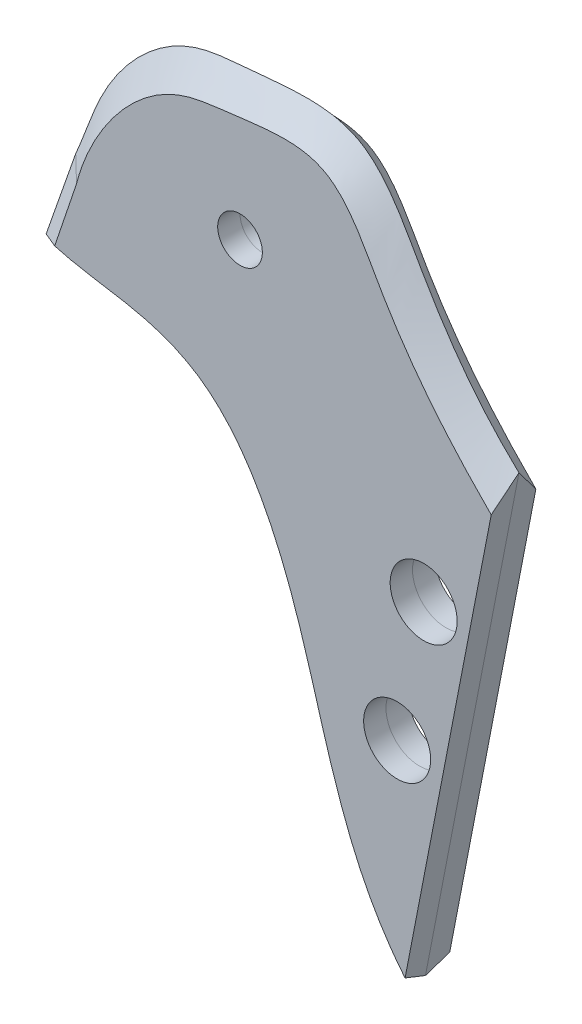
ISO-10303-21;
HEADER;
FILE_DESCRIPTION(('STEP AP214'),'2;1');
FILE_NAME('part.step','',(''),(''),'','','');
FILE_SCHEMA(('AUTOMOTIVE_DESIGN { 1 0 10303 214 1 1 1 1 }'));
ENDSEC;
DATA;
#1=APPLICATION_CONTEXT('core data for automotive mechanical design processes');
#2=APPLICATION_PROTOCOL_DEFINITION('international standard','automotive_design',2000,#1);
#3=PRODUCT_CONTEXT('',#1,'mechanical');
#4=PRODUCT('Part','Part','',(#3));
#5=PRODUCT_RELATED_PRODUCT_CATEGORY('part','',(#4));
#6=PRODUCT_DEFINITION_FORMATION('','',#4);
#7=PRODUCT_DEFINITION_CONTEXT('part definition',#1,'design');
#8=PRODUCT_DEFINITION('design','',#6,#7);
#9=PRODUCT_DEFINITION_SHAPE('','',#8);
#10=(LENGTH_UNIT() NAMED_UNIT(*) SI_UNIT(.MILLI.,.METRE.));
#11=(NAMED_UNIT(*) PLANE_ANGLE_UNIT() SI_UNIT($,.RADIAN.));
#12=(NAMED_UNIT(*) SI_UNIT($,.STERADIAN.) SOLID_ANGLE_UNIT());
#13=UNCERTAINTY_MEASURE_WITH_UNIT(LENGTH_MEASURE(1.E-05),#10,'distance_accuracy_value','');
#14=(GEOMETRIC_REPRESENTATION_CONTEXT(3) GLOBAL_UNCERTAINTY_ASSIGNED_CONTEXT((#13)) GLOBAL_UNIT_ASSIGNED_CONTEXT((#10,
#11,#12)) REPRESENTATION_CONTEXT('',''));
#15=CARTESIAN_POINT('',(0.,0.,0.));
#16=DIRECTION('',(0.,0.,1.));
#17=DIRECTION('',(1.,0.,0.));
#18=AXIS2_PLACEMENT_3D('',#15,#16,#17);
#19=CARTESIAN_POINT('',(0.,0.,16.01702912884));
#20=DIRECTION('',(0.,0.,-1.));
#21=DIRECTION('',(-1.,0.,0.));
#22=AXIS2_PLACEMENT_3D('',#19,#20,#21);
#23=PLANE('',#22);
#24=CARTESIAN_POINT('',(37.1997621715917,16.6182196540824,16.01702912884));
#25=DIRECTION('',(0.,0.,-1.));
#26=DIRECTION('',(-1.,0.,0.));
#27=AXIS2_PLACEMENT_3D('',#24,#25,#26);
#28=CIRCLE('',#27,1.7);
#29=CARTESIAN_POINT('',(35.4997621715917,16.6182196540824,16.01702912884));
#30=VERTEX_POINT('',#29);
#31=EDGE_CURVE('E188',#30,#30,#28,.F.);
#32=ORIENTED_EDGE('',*,*,#31,.T.);
#33=EDGE_LOOP('',(#32));
#34=FACE_BOUND('',#33,.T.);
#35=CARTESIAN_POINT('',(49.1635521652925,-10.4166543376605,16.01702912884));
#36=DIRECTION('',(0.,0.,-1.));
#37=DIRECTION('',(-1.,0.,0.));
#38=AXIS2_PLACEMENT_3D('',#35,#36,#37);
#39=CIRCLE('',#38,2.54999999999999);
#40=CARTESIAN_POINT('',(46.6135521652925,-10.4166543376605,16.01702912884));
#41=VERTEX_POINT('',#40);
#42=EDGE_CURVE('E240',#41,#41,#39,.F.);
#43=ORIENTED_EDGE('',*,*,#42,.T.);
#44=EDGE_LOOP('',(#43));
#45=FACE_BOUND('',#44,.T.);
#46=CARTESIAN_POINT('',(56.7374791845424,10.1611521460587,16.01702912884));
#47=CARTESIAN_POINT('',(53.6201790954461,13.0770034793296,16.01702912884));
#48=CARTESIAN_POINT('',(50.0180932993099,18.1127380968674,16.01702912884));
#49=CARTESIAN_POINT('',(45.1972513004322,27.6593441288069,16.01702912884));
#50=CARTESIAN_POINT('',(37.5823057666446,26.5396477813974,16.01702912884));
#51=CARTESIAN_POINT('',(30.2888783292712,26.1262149818505,16.01702912884));
#52=CARTESIAN_POINT('',(25.1507624600812,20.7991546822461,16.01702912884));
#53=CARTESIAN_POINT('',(23.7062806262853,15.9520347530322,16.01702912884));
#54=CARTESIAN_POINT('',(22.9879280203535,14.3317152162057,16.01702912884));
#55=B_SPLINE_CURVE_WITH_KNOTS('',3,(#46,#47,#48,#49,#50,#51,#52,#53,#54),.UNSPECIFIED.,.F.,.F.,
(4,1,1,1,1,1,4),(0.0984022232735256,0.332263847237948,0.478784406260262,0.635689441844704,
0.712428507943073,0.897170220945366,1.),.UNSPECIFIED.);
#56=CARTESIAN_POINT('',(56.7374791845424,10.1611521460587,16.01702912884));
#57=VERTEX_POINT('',#56);
#58=CARTESIAN_POINT('',(22.9879280203535,14.3317152162057,16.01702912884));
#59=VERTEX_POINT('',#58);
#60=EDGE_CURVE('E13',#57,#59,#55,.T.);
#61=ORIENTED_EDGE('',*,*,#60,.F.);
#62=DIRECTION('',(-0.190360349727867,-0.981714284938079,0.));
#63=VECTOR('',#62,1.);
#64=CARTESIAN_POINT('',(54.4053665233455,-1.86587090183388,16.01702912884));
#65=LINE('',#64,#63);
#66=CARTESIAN_POINT('',(49.6196669779243,-26.5463761324561,16.01702912884));
#67=VERTEX_POINT('',#66);
#68=EDGE_CURVE('E118',#57,#67,#65,.T.);
#69=ORIENTED_EDGE('',*,*,#68,.T.);
#70=CARTESIAN_POINT('',(20.7358239624741,7.90904808817925,16.01702912884));
#71=CARTESIAN_POINT('',(22.1719138725132,7.78885329292571,16.01702912884));
#72=CARTESIAN_POINT('',(25.4971097036187,7.8573029401953,16.01702912884));
#73=CARTESIAN_POINT('',(29.7297821332798,6.63741892427981,16.01702912884));
#74=CARTESIAN_POINT('',(35.1017046824072,5.01907956722342,16.01702912884));
#75=CARTESIAN_POINT('',(42.865459225879,-6.75778599450246,16.01702912884));
#76=CARTESIAN_POINT('',(43.2492805940054,-18.7500409121456,16.01702912884));
#77=CARTESIAN_POINT('',(49.6196669779243,-26.5463761324561,16.01702912884));
#78=B_SPLINE_CURVE_WITH_KNOTS('',3,(#70,#71,#72,#73,#74,#75,#76,#77),.UNSPECIFIED.,.F.,.F.,(4,1,
1,1,1,4),(0.,0.0884615216593502,0.20051623120789,0.26879982875652,0.4246044812526,1.),.UNSPECIFIED.);
#79=CARTESIAN_POINT('',(20.7358239624741,7.90904808817925,16.01702912884));
#80=VERTEX_POINT('',#79);
#81=EDGE_CURVE('E59',#80,#67,#78,.T.);
#82=ORIENTED_EDGE('',*,*,#81,.F.);
#83=DIRECTION('',(-0.330896267797108,-0.943667134088045,0.));
#84=VECTOR('',#83,1.);
#85=CARTESIAN_POINT('',(22.9879280203535,14.3317152162057,16.01702912884));
#86=LINE('',#85,#84);
#87=EDGE_CURVE('E224',#59,#80,#86,.T.);
#88=ORIENTED_EDGE('',*,*,#87,.F.);
#89=EDGE_LOOP('',(#61,#69,#82,#88));
#90=FACE_BOUND('',#89,.T.);
#91=CARTESIAN_POINT('',(51.1823021652925,-0.288224536730692,16.01702912884));
#92=DIRECTION('',(0.,0.,-1.));
#93=DIRECTION('',(-1.,0.,0.));
#94=AXIS2_PLACEMENT_3D('',#91,#92,#93);
#95=CIRCLE('',#94,2.55);
#96=CARTESIAN_POINT('',(48.6323021652925,-0.288224536730692,16.01702912884));
#97=VERTEX_POINT('',#96);
#98=EDGE_CURVE('E295',#97,#97,#95,.F.);
#99=ORIENTED_EDGE('',*,*,#98,.T.);
#100=EDGE_LOOP('',(#99));
#101=FACE_BOUND('',#100,.T.);
#102=ADVANCED_FACE('F50',(#34,#45,#90,#101),#23,.T.);
#103=CARTESIAN_POINT('',(56.7374791845424,10.1611521460587,16.01702912884));
#104=CARTESIAN_POINT('',(56.3247621715917,8.03271422382369,17.71702912884));
#105=CARTESIAN_POINT('',(53.6201790954461,13.0770034793296,16.01702912884));
#106=CARTESIAN_POINT('',(53.4815340141107,10.8813682024356,17.71702912884));
#107=CARTESIAN_POINT('',(50.9276386605399,16.8411889664497,16.01702912884));
#108=CARTESIAN_POINT('',(50.6303744477103,14.1981402639373,17.71702912884));
#109=CARTESIAN_POINT('',(47.4668919484403,23.1648253070632,16.01702912884));
#110=CARTESIAN_POINT('',(47.2667425586454,19.7150457705081,17.71702912884));
#111=CARTESIAN_POINT('',(45.4662591057677,25.8150722220901,16.01702912884));
#112=CARTESIAN_POINT('',(45.7145385390748,22.7407509049763,17.71702912884));
#113=CARTESIAN_POINT('',(41.4908067982299,27.1143510815713,16.01702912884));
#114=CARTESIAN_POINT('',(42.6933411886686,25.2368619241954,17.71702912884));
#115=CARTESIAN_POINT('',(37.9577758668488,26.6416571868208,16.01702912884));
#116=CARTESIAN_POINT('',(39.4587516791819,24.9632796151015,17.71702912884));
#117=CARTESIAN_POINT('',(34.4403844972373,26.3615458783455,16.01702912884));
#118=CARTESIAN_POINT('',(36.052554326043,24.5184502229449,17.71702912884));
#119=CARTESIAN_POINT('',(32.7201382629059,26.1402152904171,16.01702912884));
#120=CARTESIAN_POINT('',(34.3900462403712,24.3501831932131,17.71702912884));
#121=CARTESIAN_POINT('',(28.8729837341728,24.6582535582475,16.01702912884));
#122=CARTESIAN_POINT('',(30.6843016318662,23.4039560479854,17.71702912884));
#123=CARTESIAN_POINT('',(25.0319533013774,20.400477296728,16.01702912884));
#124=CARTESIAN_POINT('',(26.9291205566539,19.7912997497251,17.71702912884));
#125=CARTESIAN_POINT('',(23.7062806262853,15.9520347530322,16.01702912884));
#126=CARTESIAN_POINT('',(25.1314869237919,15.6032090618174,17.71702912884));
#127=CARTESIAN_POINT('',(22.9879280203535,14.3317152162057,16.01702912884));
#128=CARTESIAN_POINT('',(24.7497084623282,14.0682196540823,17.71702912884));
#129=B_SPLINE_SURFACE_WITH_KNOTS('',3,1,((#103,#104),(#105,#106),(#107,#108),(#109,#110),(#111,
#112),(#113,#114),(#115,#116),(#117,#118),(#119,#120),(#121,#122),(#123,#124),(#125,#126),(#127,
#128)),.UNSPECIFIED.,.F.,.F.,.F.,(4,1,1,1,1,1,1,1,1,1,4),(2,2),(0.,0.259385759372132,
0.315366468989364,0.421897871540711,0.46461990204709,0.595927843258402,0.621804756140367,
0.681042367805029,0.707276749613521,0.88594716878297,1.),(0.,1.),.UNSPECIFIED.);
#130=DIRECTION('',(0.715479586900087,-0.107008621191608,0.69038982880685));
#131=VECTOR('',#130,1.);
#132=CARTESIAN_POINT('',(23.8688182413409,14.199967435144,16.86702912884));
#133=LINE('',#132,#131);
#134=CARTESIAN_POINT('',(24.7497084623282,14.0682196540823,17.71702912884));
#135=VERTEX_POINT('',#134);
#136=EDGE_CURVE('E111',#59,#135,#133,.T.);
#137=CARTESIAN_POINT('',(56.3247621715917,8.03271422382369,17.71702912884));
#138=CARTESIAN_POINT('',(52.8679076907351,11.496165528097,17.71702912884));
#139=CARTESIAN_POINT('',(48.8599680154124,16.3360273622185,17.71702912884));
#140=CARTESIAN_POINT('',(44.2241470254929,25.775486125325,17.71702912884));
#141=CARTESIAN_POINT('',(37.567466531524,24.6409319402532,17.71702912884));
#142=CARTESIAN_POINT('',(29.7072493366158,23.9216854788249,17.71702912884));
#143=CARTESIAN_POINT('',(25.7295651741228,18.0078595906483,17.71702912884));
#144=CARTESIAN_POINT('',(24.7497084623282,14.0682196540823,17.71702912884));
#145=B_SPLINE_CURVE_WITH_KNOTS('',3,(#137,#138,#139,#140,#141,#142,#143,#144),.UNSPECIFIED.,.F.,
.F.,(4,1,1,1,1,4),(0.,0.315366468989364,0.46461990204709,0.621804756140367,0.707276749613521,
1.),.UNSPECIFIED.);
#146=CARTESIAN_POINT('',(56.3247621715917,8.03271422382369,17.71702912884));
#147=VERTEX_POINT('',#146);
#148=EDGE_CURVE('E94',#147,#135,#145,.T.);
#149=DIRECTION('',(0.149801028702046,0.772544334917706,-0.617037196922818));
#150=VECTOR('',#149,1.);
#151=CARTESIAN_POINT('',(56.5311206780671,9.09693318494118,16.86702912884));
#152=LINE('',#151,#150);
#153=EDGE_CURVE('E109',#147,#57,#152,.T.);
#154=ORIENTED_EDGE('',*,*,#60,.T.);
#155=ORIENTED_EDGE('',*,*,#136,.T.);
#156=ORIENTED_EDGE('',*,*,#148,.F.);
#157=ORIENTED_EDGE('',*,*,#153,.T.);
#158=EDGE_LOOP('',(#154,#155,#156,#157));
#159=FACE_BOUND('',#158,.T.);
#160=ADVANCED_FACE('F108',(#159),#129,.T.);
#161=CARTESIAN_POINT('',(22.9879280203535,14.3317152162057,16.01702912884));
#162=CARTESIAN_POINT('',(24.7497084623282,14.0682196540823,17.71702912884));
#163=CARTESIAN_POINT('',(22.6125773440403,13.261270694868,16.01702912884));
#164=CARTESIAN_POINT('',(24.4726287269215,13.2476373607624,17.71702912884));
#165=CARTESIAN_POINT('',(22.2372266677271,12.1908261735302,16.01702912884));
#166=CARTESIAN_POINT('',(24.1955489915148,12.4270550674425,17.71702912884));
#167=CARTESIAN_POINT('',(21.4865253151006,10.0499371308547,16.01702912884));
#168=CARTESIAN_POINT('',(23.6413895207013,10.7858904808026,17.71702912884));
#169=CARTESIAN_POINT('',(21.1111746387874,8.97949260951699,16.01702912884));
#170=CARTESIAN_POINT('',(23.3643097852946,9.96530818748272,17.71702912884));
#171=CARTESIAN_POINT('',(20.7358239624741,7.90904808817925,16.01702912884));
#172=CARTESIAN_POINT('',(23.0872300498878,9.14472589416278,17.71702912884));
#173=B_SPLINE_SURFACE_WITH_KNOTS('',3,1,((#161,#162),(#163,#164),(#165,#166),(#167,#168),(#169,
#170),(#171,#172)),.UNSPECIFIED.,.F.,.F.,.F.,(4,2,4),(2,2),(0.,0.5,1.),(0.,1.),.UNSPECIFIED.);
#174=DIRECTION('',(0.745595344172381,0.391814763077272,0.539044315602316));
#175=VECTOR('',#174,1.);
#176=CARTESIAN_POINT('',(21.911527006181,8.52688699117102,16.86702912884));
#177=LINE('',#176,#175);
#178=CARTESIAN_POINT('',(23.0872300498878,9.14472589416278,17.71702912884));
#179=VERTEX_POINT('',#178);
#180=EDGE_CURVE('E124',#80,#179,#177,.T.);
#181=DIRECTION('',(-0.319916718913096,-0.947445667550324,0.));
#182=VECTOR('',#181,1.);
#183=CARTESIAN_POINT('',(24.7497084623282,14.0682196540823,17.71702912884));
#184=LINE('',#183,#182);
#185=EDGE_CURVE('E183',#135,#179,#184,.T.);
#186=ORIENTED_EDGE('',*,*,#87,.T.);
#187=ORIENTED_EDGE('',*,*,#180,.T.);
#188=ORIENTED_EDGE('',*,*,#185,.F.);
#189=ORIENTED_EDGE('',*,*,#136,.F.);
#190=EDGE_LOOP('',(#186,#187,#188,#189));
#191=FACE_BOUND('',#190,.T.);
#192=ADVANCED_FACE('F152',(#191),#173,.T.);
#193=CARTESIAN_POINT('',(42.2011849808601,24.8148172093596,17.71702912884));
#194=DIRECTION('',(0.,0.,1.));
#195=DIRECTION('',(1.,0.,0.));
#196=AXIS2_PLACEMENT_3D('',#193,#194,#195);
#197=PLANE('',#196);
#198=CARTESIAN_POINT('',(49.1635521652925,-10.4166543376605,17.71702912884));
#199=DIRECTION('',(0.,0.,1.));
#200=DIRECTION('',(1.,0.,0.));
#201=AXIS2_PLACEMENT_3D('',#198,#199,#200);
#202=CIRCLE('',#201,2.54999999999999);
#203=CARTESIAN_POINT('',(51.7135521652925,-10.4166543376605,17.71702912884));
#204=VERTEX_POINT('',#203);
#205=EDGE_CURVE('E225',#204,#204,#202,.T.);
#206=ORIENTED_EDGE('',*,*,#205,.F.);
#207=EDGE_LOOP('',(#206));
#208=FACE_BOUND('',#207,.T.);
#209=CARTESIAN_POINT('',(51.1823021652925,-0.288224536730692,17.71702912884));
#210=DIRECTION('',(0.,0.,1.));
#211=DIRECTION('',(1.,0.,0.));
#212=AXIS2_PLACEMENT_3D('',#209,#210,#211);
#213=CIRCLE('',#212,2.55);
#214=CARTESIAN_POINT('',(53.7323021652925,-0.288224536730692,17.71702912884));
#215=VERTEX_POINT('',#214);
#216=EDGE_CURVE('E122',#215,#215,#213,.T.);
#217=ORIENTED_EDGE('',*,*,#216,.F.);
#218=EDGE_LOOP('',(#217));
#219=FACE_BOUND('',#218,.T.);
#220=CARTESIAN_POINT('',(37.1997621715917,16.6182196540824,17.71702912884));
#221=DIRECTION('',(0.,0.,1.));
#222=DIRECTION('',(1.,0.,0.));
#223=AXIS2_PLACEMENT_3D('',#220,#221,#222);
#224=CIRCLE('',#223,1.7);
#225=CARTESIAN_POINT('',(38.8997621715917,16.6182196540824,17.71702912884));
#226=VERTEX_POINT('',#225);
#227=EDGE_CURVE('E119',#226,#226,#224,.T.);
#228=ORIENTED_EDGE('',*,*,#227,.F.);
#229=EDGE_LOOP('',(#228));
#230=FACE_BOUND('',#229,.T.);
#231=ORIENTED_EDGE('',*,*,#148,.T.);
#232=ORIENTED_EDGE('',*,*,#185,.T.);
#233=CARTESIAN_POINT('',(23.0872300498878,9.14472589416278,17.71702912884));
#234=CARTESIAN_POINT('',(23.9071552614502,8.90389135487674,17.71702912884));
#235=CARTESIAN_POINT('',(26.4147155565695,8.40600553783021,17.71702912884));
#236=CARTESIAN_POINT('',(30.1574904202226,7.93532093414824,17.71702912884));
#237=CARTESIAN_POINT('',(35.409397744306,5.68865065157843,17.71702912884));
#238=CARTESIAN_POINT('',(43.4811194703326,-5.64116995348703,17.71702912884));
#239=CARTESIAN_POINT('',(43.5281504977051,-18.220731086188,17.71702912884));
#240=CARTESIAN_POINT('',(49.7666771672669,-25.7882245367307,17.71702912884));
#241=B_SPLINE_CURVE_WITH_KNOTS('',3,(#233,#234,#235,#236,#237,#238,#239,#240),.UNSPECIFIED.,.F.,
.F.,(4,1,1,1,1,4),(0.,0.0541824296374315,0.16221333097239,0.238719582243554,0.409718141961211,
1.),.UNSPECIFIED.);
#242=CARTESIAN_POINT('',(49.7666771672669,-25.7882245367307,17.71702912884));
#243=VERTEX_POINT('',#242);
#244=EDGE_CURVE('E97',#179,#243,#241,.T.);
#245=ORIENTED_EDGE('',*,*,#244,.T.);
#246=DIRECTION('',(0.190360349727867,0.981714284938079,0.));
#247=VECTOR('',#246,1.);
#248=CARTESIAN_POINT('',(49.7666771672668,-25.7882245367307,17.71702912884));
#249=LINE('',#248,#247);
#250=EDGE_CURVE('E90',#243,#147,#249,.T.);
#251=ORIENTED_EDGE('',*,*,#250,.T.);
#252=EDGE_LOOP('',(#231,#232,#245,#251));
#253=FACE_BOUND('',#252,.T.);
#254=ADVANCED_FACE('F93',(#208,#219,#230,#253),#197,.T.);
#255=CARTESIAN_POINT('',(54.4053665233455,-1.86587090183388,9.68452912884005));
#256=DIRECTION('',(-0.981714284938079,0.190360349727867,0.));
#257=DIRECTION('',(-0.190360349727867,-0.981714284938079,0.));
#258=AXIS2_PLACEMENT_3D('',#255,#256,#257);
#259=PLANE('',#258);
#260=ORIENTED_EDGE('',*,*,#68,.F.);
#261=ORIENTED_EDGE('',*,*,#153,.F.);
#262=ORIENTED_EDGE('',*,*,#250,.F.);
#263=DIRECTION('',(0.0787333022099367,0.40603837716383,0.910458073385745));
#264=VECTOR('',#263,1.);
#265=CARTESIAN_POINT('',(49.6931720725956,-26.1673003345934,16.86702912884));
#266=LINE('',#265,#264);
#267=EDGE_CURVE('E113',#67,#243,#266,.T.);
#268=ORIENTED_EDGE('',*,*,#267,.F.);
#269=EDGE_LOOP('',(#260,#261,#262,#268));
#270=FACE_BOUND('',#269,.T.);
#271=ADVANCED_FACE('F117',(#270),#259,.F.);
#272=CARTESIAN_POINT('',(20.7358239624741,7.90904808817925,16.01702912884));
#273=CARTESIAN_POINT('',(23.0872300498878,9.14472589416278,17.71702912884));
#274=CARTESIAN_POINT('',(21.6154249352378,7.83542911899976,16.01702912884));
#275=CARTESIAN_POINT('',(23.9071552614502,8.90389135487674,17.71702912884));
#276=CARTESIAN_POINT('',(23.0704306063669,7.80734939259081,16.01702912884));
#277=CARTESIAN_POINT('',(25.2746297965522,8.63237398497549,17.71702912884));
#278=CARTESIAN_POINT('',(25.7237718116332,7.64883772411055,16.01702912884));
#279=CARTESIAN_POINT('',(27.8016631900876,8.23158550964478,17.71702912884));
#280=CARTESIAN_POINT('',(28.0514115307685,7.1211363639849,16.01702912884));
#281=CARTESIAN_POINT('',(30.0713165943711,7.82488479816171,17.71702912884));
#282=CARTESIAN_POINT('',(30.4318693935687,6.42225490504846,16.01702912884));
#283=CARTESIAN_POINT('',(32.3191060824179,7.01062113064603,17.71702912884));
#284=CARTESIAN_POINT('',(32.1310659942215,5.91401084382313,16.01702912884));
#285=CARTESIAN_POINT('',(33.808843698735,6.21825298874981,17.71702912884));
#286=CARTESIAN_POINT('',(35.2507090670857,4.55315707015074,16.01702912884));
#287=CARTESIAN_POINT('',(36.4363137620361,4.24722654749472,17.71702912884));
#288=CARTESIAN_POINT('',(37.1332559765229,1.93741252860381,16.01702912884));
#289=CARTESIAN_POINT('',(38.1569260374253,1.71136973947847,17.71702912884));
#290=CARTESIAN_POINT('',(42.939430023337,-9.06895658906215,16.01702912884));
#291=CARTESIAN_POINT('',(43.4926032252927,-8.71277194953148,17.71702912884));
#292=CARTESIAN_POINT('',(43.2492805940054,-18.7500409121456,16.01702912884));
#293=CARTESIAN_POINT('',(43.6854801249277,-18.4115759741953,17.71702912884));
#294=CARTESIAN_POINT('',(49.6196669779243,-26.5463761324561,16.01702912884));
#295=CARTESIAN_POINT('',(49.7666771672669,-25.7882245367307,17.71702912884));
#296=B_SPLINE_SURFACE_WITH_KNOTS('',3,1,((#272,#273),(#274,#275),(#276,#277),(#278,#279),(#280,
#281),(#282,#283),(#284,#285),(#286,#287),(#288,#289),(#290,#291),(#292,#293),(#294,#295)),
.UNSPECIFIED.,.F.,.F.,.F.,(4,1,1,1,1,1,1,1,1,4),(2,2),(0.,0.0541824296374315,0.0884615216593502,
0.16221333097239,0.20051623120789,0.238719582243554,0.26879982875652,0.409718141961211,
0.4246044812526,1.),(0.,1.),.UNSPECIFIED.);
#297=ORIENTED_EDGE('',*,*,#81,.T.);
#298=ORIENTED_EDGE('',*,*,#267,.T.);
#299=ORIENTED_EDGE('',*,*,#244,.F.);
#300=ORIENTED_EDGE('',*,*,#180,.F.);
#301=EDGE_LOOP('',(#297,#298,#299,#300));
#302=FACE_BOUND('',#301,.T.);
#303=ADVANCED_FACE('F138',(#302),#296,.T.);
#304=CARTESIAN_POINT('',(49.1635521652925,-10.4166543376605,4.55453996073728));
#305=DIRECTION('',(0.,0.,1.));
#306=DIRECTION('',(1.,0.,0.));
#307=AXIS2_PLACEMENT_3D('',#304,#305,#306);
#308=CYLINDRICAL_SURFACE('',#307,2.54999999999999);
#309=ORIENTED_EDGE('',*,*,#205,.T.);
#310=EDGE_LOOP('',(#309));
#311=FACE_BOUND('',#310,.T.);
#312=ORIENTED_EDGE('',*,*,#42,.F.);
#313=EDGE_LOOP('',(#312));
#314=FACE_BOUND('',#313,.T.);
#315=ADVANCED_FACE('F52',(#311,#314),#308,.F.);
#316=CARTESIAN_POINT('',(51.1823021652925,-0.288224536730692,4.55453996073724));
#317=DIRECTION('',(0.,0.,1.));
#318=DIRECTION('',(1.,0.,0.));
#319=AXIS2_PLACEMENT_3D('',#316,#317,#318);
#320=CYLINDRICAL_SURFACE('',#319,2.55);
#321=ORIENTED_EDGE('',*,*,#216,.T.);
#322=EDGE_LOOP('',(#321));
#323=FACE_BOUND('',#322,.T.);
#324=ORIENTED_EDGE('',*,*,#98,.F.);
#325=EDGE_LOOP('',(#324));
#326=FACE_BOUND('',#325,.T.);
#327=ADVANCED_FACE('F266',(#323,#326),#320,.F.);
#328=CARTESIAN_POINT('',(37.1997621715917,16.6182196540824,15.59202912884));
#329=DIRECTION('',(0.,0.,1.));
#330=DIRECTION('',(1.,0.,0.));
#331=AXIS2_PLACEMENT_3D('',#328,#329,#330);
#332=CYLINDRICAL_SURFACE('',#331,1.7);
#333=ORIENTED_EDGE('',*,*,#227,.T.);
#334=EDGE_LOOP('',(#333));
#335=FACE_BOUND('',#334,.T.);
#336=ORIENTED_EDGE('',*,*,#31,.F.);
#337=EDGE_LOOP('',(#336));
#338=FACE_BOUND('',#337,.T.);
#339=ADVANCED_FACE('F251',(#335,#338),#332,.F.);
#340=CLOSED_SHELL('',(#102,#160,#192,#254,#271,#303,#315,#327,#339));
#341=MANIFOLD_SOLID_BREP('B2',#340);
#342=CARTESIAN_POINT('',(0.,0.,16.01702912884));
#343=DIRECTION('',(0.,0.,-1.));
#344=DIRECTION('',(-1.,0.,0.));
#345=AXIS2_PLACEMENT_3D('',#342,#343,#344);
#346=PLANE('',#345);
#347=CARTESIAN_POINT('',(51.1823021652925,-0.288224536730692,16.01702912884));
#348=DIRECTION('',(0.,0.,-1.));
#349=DIRECTION('',(-1.,0.,0.));
#350=AXIS2_PLACEMENT_3D('',#347,#348,#349);
#351=CIRCLE('',#350,2.55);
#352=CARTESIAN_POINT('',(48.6323021652925,-0.288224536730692,16.01702912884));
#353=VERTEX_POINT('',#352);
#354=EDGE_CURVE('E594',#353,#353,#351,.F.);
#355=ORIENTED_EDGE('',*,*,#354,.F.);
#356=EDGE_LOOP('',(#355));
#357=FACE_BOUND('',#356,.T.);
#358=CARTESIAN_POINT('',(56.7374791845424,10.1611521460587,16.01702912884));
#359=CARTESIAN_POINT('',(53.6201790954461,13.0770034793296,16.01702912884));
#360=CARTESIAN_POINT('',(50.0180932993099,18.1127380968674,16.01702912884));
#361=CARTESIAN_POINT('',(45.1972513004322,27.6593441288069,16.01702912884));
#362=CARTESIAN_POINT('',(37.5823057666446,26.5396477813974,16.01702912884));
#363=CARTESIAN_POINT('',(30.2888783292712,26.1262149818505,16.01702912884));
#364=CARTESIAN_POINT('',(25.1507624600812,20.7991546822461,16.01702912884));
#365=CARTESIAN_POINT('',(23.7062806262853,15.9520347530322,16.01702912884));
#366=CARTESIAN_POINT('',(22.9879280203535,14.3317152162057,16.01702912884));
#367=B_SPLINE_CURVE_WITH_KNOTS('',3,(#358,#359,#360,#361,#362,#363,#364,#365,#366),
.UNSPECIFIED.,.F.,.F.,(4,1,1,1,1,1,4),(0.0984022232735256,0.332263847237948,0.478784406260262,
0.635689441844704,0.712428507943073,0.897170220945366,1.),.UNSPECIFIED.);
#368=CARTESIAN_POINT('',(56.7374791845424,10.1611521460587,16.01702912884));
#369=VERTEX_POINT('',#368);
#370=CARTESIAN_POINT('',(22.9879280203535,14.3317152162057,16.01702912884));
#371=VERTEX_POINT('',#370);
#372=EDGE_CURVE('E48',#369,#371,#367,.T.);
#373=ORIENTED_EDGE('',*,*,#372,.T.);
#374=DIRECTION('',(-0.330896267797108,-0.943667134088045,0.));
#375=VECTOR('',#374,1.);
#376=CARTESIAN_POINT('',(22.9879280203535,14.3317152162057,16.01702912884));
#377=LINE('',#376,#375);
#378=CARTESIAN_POINT('',(20.7358239624741,7.90904808817925,16.01702912884));
#379=VERTEX_POINT('',#378);
#380=EDGE_CURVE('E430',#371,#379,#377,.T.);
#381=ORIENTED_EDGE('',*,*,#380,.T.);
#382=CARTESIAN_POINT('',(49.6196669779243,-26.5463761324561,16.01702912884));
#383=CARTESIAN_POINT('',(43.2492805940054,-18.7500409121456,16.01702912884));
#384=CARTESIAN_POINT('',(42.939430023337,-9.06895658906215,16.01702912884));
#385=CARTESIAN_POINT('',(37.1332559765229,1.93741252860381,16.01702912884));
#386=CARTESIAN_POINT('',(35.2507090670857,4.55315707015074,16.01702912884));
#387=CARTESIAN_POINT('',(32.1310659942215,5.91401084382313,16.01702912884));
#388=CARTESIAN_POINT('',(30.4318693935687,6.42225490504846,16.01702912884));
#389=CARTESIAN_POINT('',(28.0514115307685,7.1211363639849,16.01702912884));
#390=CARTESIAN_POINT('',(25.7237718116332,7.64883772411055,16.01702912884));
#391=CARTESIAN_POINT('',(23.0704306063669,7.80734939259081,16.01702912884));
#392=CARTESIAN_POINT('',(21.6154249352378,7.83542911899976,16.01702912884));
#393=CARTESIAN_POINT('',(20.7358239624741,7.90904808817925,16.01702912884));
#394=B_SPLINE_CURVE_WITH_KNOTS('',3,(#382,#383,#384,#385,#386,#387,#388,#389,#390,#391,#392,
#393),.UNSPECIFIED.,.F.,.F.,(4,1,1,1,1,1,1,1,1,4),(0.,0.5753955187474,0.590281858038789,
0.73120017124348,0.761280417756446,0.79948376879211,0.83778666902761,0.91153847834065,
0.945817570362568,1.),.UNSPECIFIED.);
#395=CARTESIAN_POINT('',(49.6196669779243,-26.5463761324561,16.01702912884));
#396=VERTEX_POINT('',#395);
#397=EDGE_CURVE('E423',#379,#396,#394,.F.);
#398=ORIENTED_EDGE('',*,*,#397,.T.);
#399=DIRECTION('',(-0.190360349727867,-0.981714284938079,0.));
#400=VECTOR('',#399,1.);
#401=CARTESIAN_POINT('',(54.4053665233455,-1.86587090183388,16.01702912884));
#402=LINE('',#401,#400);
#403=EDGE_CURVE('E436',#369,#396,#402,.T.);
#404=ORIENTED_EDGE('',*,*,#403,.F.);
#405=EDGE_LOOP('',(#373,#381,#398,#404));
#406=FACE_BOUND('',#405,.T.);
#407=CARTESIAN_POINT('',(49.1635521652925,-10.4166543376605,16.01702912884));
#408=DIRECTION('',(0.,0.,-1.));
#409=DIRECTION('',(-1.,0.,0.));
#410=AXIS2_PLACEMENT_3D('',#407,#408,#409);
#411=CIRCLE('',#410,2.54999999999999);
#412=CARTESIAN_POINT('',(46.6135521652925,-10.4166543376605,16.01702912884));
#413=VERTEX_POINT('',#412);
#414=EDGE_CURVE('E476',#413,#413,#411,.F.);
#415=ORIENTED_EDGE('',*,*,#414,.F.);
#416=EDGE_LOOP('',(#415));
#417=FACE_BOUND('',#416,.T.);
#418=CARTESIAN_POINT('',(37.1997621715917,16.6182196540824,16.01702912884));
#419=DIRECTION('',(0.,0.,-1.));
#420=DIRECTION('',(-1.,0.,0.));
#421=AXIS2_PLACEMENT_3D('',#418,#419,#420);
#422=CIRCLE('',#421,1.7);
#423=CARTESIAN_POINT('',(35.4997621715917,16.6182196540824,16.01702912884));
#424=VERTEX_POINT('',#423);
#425=EDGE_CURVE('E591',#424,#424,#422,.F.);
#426=ORIENTED_EDGE('',*,*,#425,.F.);
#427=EDGE_LOOP('',(#426));
#428=FACE_BOUND('',#427,.T.);
#429=ADVANCED_FACE('F414',(#357,#406,#417,#428),#346,.F.);
#430=CARTESIAN_POINT('',(54.4053665233455,-1.86587090183388,9.68452912884005));
#431=DIRECTION('',(-0.981714284938079,0.190360349727867,0.));
#432=DIRECTION('',(-0.190360349727867,-0.981714284938079,0.));
#433=AXIS2_PLACEMENT_3D('',#430,#431,#432);
#434=PLANE('',#433);
#435=DIRECTION('',(0.149801028702046,0.772544334917706,0.617037196922818));
#436=VECTOR('',#435,1.);
#437=CARTESIAN_POINT('',(56.5311206780671,9.09693318494118,15.16702912884));
#438=LINE('',#437,#436);
#439=CARTESIAN_POINT('',(56.3247621715917,8.03271422382369,14.31702912884));
#440=VERTEX_POINT('',#439);
#441=EDGE_CURVE('E464',#440,#369,#438,.T.);
#442=ORIENTED_EDGE('',*,*,#441,.T.);
#443=ORIENTED_EDGE('',*,*,#403,.T.);
#444=DIRECTION('',(0.0787333022099367,0.40603837716383,-0.910458073385745));
#445=VECTOR('',#444,1.);
#446=CARTESIAN_POINT('',(49.6931720725956,-26.1673003345934,15.16702912884));
#447=LINE('',#446,#445);
#448=CARTESIAN_POINT('',(49.7666771672669,-25.7882245367307,14.31702912884));
#449=VERTEX_POINT('',#448);
#450=EDGE_CURVE('E485',#396,#449,#447,.T.);
#451=ORIENTED_EDGE('',*,*,#450,.T.);
#452=DIRECTION('',(0.190360349727867,0.981714284938079,0.));
#453=VECTOR('',#452,1.);
#454=CARTESIAN_POINT('',(49.7666771672668,-25.7882245367307,14.31702912884));
#455=LINE('',#454,#453);
#456=EDGE_CURVE('E484',#449,#440,#455,.T.);
#457=ORIENTED_EDGE('',*,*,#456,.T.);
#458=EDGE_LOOP('',(#442,#443,#451,#457));
#459=FACE_BOUND('',#458,.T.);
#460=ADVANCED_FACE('F651',(#459),#434,.F.);
#461=CARTESIAN_POINT('',(37.1997621715917,16.6182196540824,15.59202912884));
#462=DIRECTION('',(0.,0.,1.));
#463=DIRECTION('',(1.,0.,0.));
#464=AXIS2_PLACEMENT_3D('',#461,#462,#463);
#465=CYLINDRICAL_SURFACE('',#464,1.7);
#466=ORIENTED_EDGE('',*,*,#425,.T.);
#467=EDGE_LOOP('',(#466));
#468=FACE_BOUND('',#467,.T.);
#469=CARTESIAN_POINT('',(37.1997621715917,16.6182196540824,14.31702912884));
#470=DIRECTION('',(0.,0.,1.));
#471=DIRECTION('',(1.,0.,0.));
#472=AXIS2_PLACEMENT_3D('',#469,#470,#471);
#473=CIRCLE('',#472,1.7);
#474=CARTESIAN_POINT('',(38.8997621715917,16.6182196540824,14.31702912884));
#475=VERTEX_POINT('',#474);
#476=EDGE_CURVE('E625',#475,#475,#473,.T.);
#477=ORIENTED_EDGE('',*,*,#476,.F.);
#478=EDGE_LOOP('',(#477));
#479=FACE_BOUND('',#478,.T.);
#480=ADVANCED_FACE('F648',(#468,#479),#465,.F.);
#481=CARTESIAN_POINT('',(51.1823021652925,-0.288224536730692,4.55453996073724));
#482=DIRECTION('',(0.,0.,1.));
#483=DIRECTION('',(1.,0.,0.));
#484=AXIS2_PLACEMENT_3D('',#481,#482,#483);
#485=CYLINDRICAL_SURFACE('',#484,2.55);
#486=ORIENTED_EDGE('',*,*,#354,.T.);
#487=EDGE_LOOP('',(#486));
#488=FACE_BOUND('',#487,.T.);
#489=CARTESIAN_POINT('',(51.1823021652925,-0.288224536730692,14.31702912884));
#490=DIRECTION('',(0.,0.,1.));
#491=DIRECTION('',(1.,0.,0.));
#492=AXIS2_PLACEMENT_3D('',#489,#490,#491);
#493=CIRCLE('',#492,2.55);
#494=CARTESIAN_POINT('',(53.7323021652925,-0.288224536730692,14.31702912884));
#495=VERTEX_POINT('',#494);
#496=EDGE_CURVE('E628',#495,#495,#493,.T.);
#497=ORIENTED_EDGE('',*,*,#496,.F.);
#498=EDGE_LOOP('',(#497));
#499=FACE_BOUND('',#498,.T.);
#500=ADVANCED_FACE('F643',(#488,#499),#485,.F.);
#501=CARTESIAN_POINT('',(49.1635521652925,-10.4166543376605,4.55453996073728));
#502=DIRECTION('',(0.,0.,1.));
#503=DIRECTION('',(1.,0.,0.));
#504=AXIS2_PLACEMENT_3D('',#501,#502,#503);
#505=CYLINDRICAL_SURFACE('',#504,2.54999999999999);
#506=ORIENTED_EDGE('',*,*,#414,.T.);
#507=EDGE_LOOP('',(#506));
#508=FACE_BOUND('',#507,.T.);
#509=CARTESIAN_POINT('',(49.1635521652925,-10.4166543376605,14.31702912884));
#510=DIRECTION('',(0.,0.,1.));
#511=DIRECTION('',(1.,0.,0.));
#512=AXIS2_PLACEMENT_3D('',#509,#510,#511);
#513=CIRCLE('',#512,2.54999999999999);
#514=CARTESIAN_POINT('',(51.7135521652925,-10.4166543376605,14.31702912884));
#515=VERTEX_POINT('',#514);
#516=EDGE_CURVE('E633',#515,#515,#513,.T.);
#517=ORIENTED_EDGE('',*,*,#516,.F.);
#518=EDGE_LOOP('',(#517));
#519=FACE_BOUND('',#518,.T.);
#520=ADVANCED_FACE('F555',(#508,#519),#505,.F.);
#521=CARTESIAN_POINT('',(42.2011849808601,24.8148172093596,14.31702912884));
#522=DIRECTION('',(0.,0.,-1.));
#523=DIRECTION('',(1.,0.,0.));
#524=AXIS2_PLACEMENT_3D('',#521,#522,#523);
#525=PLANE('',#524);
#526=ORIENTED_EDGE('',*,*,#516,.T.);
#527=EDGE_LOOP('',(#526));
#528=FACE_BOUND('',#527,.T.);
#529=ORIENTED_EDGE('',*,*,#496,.T.);
#530=EDGE_LOOP('',(#529));
#531=FACE_BOUND('',#530,.T.);
#532=ORIENTED_EDGE('',*,*,#476,.T.);
#533=EDGE_LOOP('',(#532));
#534=FACE_BOUND('',#533,.T.);
#535=CARTESIAN_POINT('',(56.3247621715917,8.03271422382369,14.31702912884));
#536=CARTESIAN_POINT('',(52.8679076907351,11.496165528097,14.31702912884));
#537=CARTESIAN_POINT('',(48.8599680154124,16.3360273622185,14.31702912884));
#538=CARTESIAN_POINT('',(44.2241470254929,25.775486125325,14.31702912884));
#539=CARTESIAN_POINT('',(37.567466531524,24.6409319402532,14.31702912884));
#540=CARTESIAN_POINT('',(29.7072493366158,23.9216854788249,14.31702912884));
#541=CARTESIAN_POINT('',(25.7295651741228,18.0078595906483,14.31702912884));
#542=CARTESIAN_POINT('',(24.7497084623282,14.0682196540823,14.31702912884));
#543=B_SPLINE_CURVE_WITH_KNOTS('',3,(#535,#536,#537,#538,#539,#540,#541,#542),.UNSPECIFIED.,.F.,
.F.,(4,1,1,1,1,4),(0.,0.315366468989364,0.46461990204709,0.621804756140367,0.707276749613521,
1.),.UNSPECIFIED.);
#544=CARTESIAN_POINT('',(24.7497084623282,14.0682196540823,14.31702912884));
#545=VERTEX_POINT('',#544);
#546=EDGE_CURVE('E471',#440,#545,#543,.T.);
#547=ORIENTED_EDGE('',*,*,#546,.F.);
#548=ORIENTED_EDGE('',*,*,#456,.F.);
#549=CARTESIAN_POINT('',(23.0872300498878,9.14472589416278,14.31702912884));
#550=CARTESIAN_POINT('',(23.9071552614502,8.90389135487674,14.31702912884));
#551=CARTESIAN_POINT('',(26.4147155565695,8.40600553783021,14.31702912884));
#552=CARTESIAN_POINT('',(30.1574904202226,7.93532093414824,14.31702912884));
#553=CARTESIAN_POINT('',(35.409397744306,5.68865065157843,14.31702912884));
#554=CARTESIAN_POINT('',(43.4811194703326,-5.64116995348703,14.31702912884));
#555=CARTESIAN_POINT('',(43.5281504977051,-18.220731086188,14.31702912884));
#556=CARTESIAN_POINT('',(49.7666771672669,-25.7882245367307,14.31702912884));
#557=B_SPLINE_CURVE_WITH_KNOTS('',3,(#549,#550,#551,#552,#553,#554,#555,#556),.UNSPECIFIED.,.F.,
.F.,(4,1,1,1,1,4),(0.,0.0541824296374315,0.16221333097239,0.238719582243554,0.409718141961211,
1.),.UNSPECIFIED.);
#558=CARTESIAN_POINT('',(23.0872300498878,9.14472589416278,14.31702912884));
#559=VERTEX_POINT('',#558);
#560=EDGE_CURVE('E474',#559,#449,#557,.T.);
#561=ORIENTED_EDGE('',*,*,#560,.F.);
#562=DIRECTION('',(-0.319916718913096,-0.947445667550324,0.));
#563=VECTOR('',#562,1.);
#564=CARTESIAN_POINT('',(24.7497084623282,14.0682196540823,14.31702912884));
#565=LINE('',#564,#563);
#566=EDGE_CURVE('E458',#545,#559,#565,.T.);
#567=ORIENTED_EDGE('',*,*,#566,.F.);
#568=EDGE_LOOP('',(#547,#548,#561,#567));
#569=FACE_BOUND('',#568,.T.);
#570=ADVANCED_FACE('F469',(#528,#531,#534,#569),#525,.T.);
#571=CARTESIAN_POINT('',(56.7374791845424,10.1611521460587,16.01702912884));
#572=CARTESIAN_POINT('',(56.3247621715917,8.03271422382369,14.31702912884));
#573=CARTESIAN_POINT('',(53.6201790954461,13.0770034793296,16.01702912884));
#574=CARTESIAN_POINT('',(53.4815340141107,10.8813682024356,14.31702912884));
#575=CARTESIAN_POINT('',(50.9276386605399,16.8411889664497,16.01702912884));
#576=CARTESIAN_POINT('',(50.6303744477103,14.1981402639373,14.31702912884));
#577=CARTESIAN_POINT('',(47.4668919484403,23.1648253070632,16.01702912884));
#578=CARTESIAN_POINT('',(47.2667425586454,19.7150457705081,14.31702912884));
#579=CARTESIAN_POINT('',(45.4662591057677,25.8150722220901,16.01702912884));
#580=CARTESIAN_POINT('',(45.7145385390748,22.7407509049763,14.31702912884));
#581=CARTESIAN_POINT('',(41.4908067982299,27.1143510815713,16.01702912884));
#582=CARTESIAN_POINT('',(42.6933411886686,25.2368619241954,14.31702912884));
#583=CARTESIAN_POINT('',(37.9577758668488,26.6416571868208,16.01702912884));
#584=CARTESIAN_POINT('',(39.4587516791819,24.9632796151015,14.31702912884));
#585=CARTESIAN_POINT('',(34.4403844972373,26.3615458783455,16.01702912884));
#586=CARTESIAN_POINT('',(36.052554326043,24.5184502229449,14.31702912884));
#587=CARTESIAN_POINT('',(32.7201382629059,26.1402152904171,16.01702912884));
#588=CARTESIAN_POINT('',(34.3900462403712,24.3501831932131,14.31702912884));
#589=CARTESIAN_POINT('',(28.8729837341728,24.6582535582475,16.01702912884));
#590=CARTESIAN_POINT('',(30.6843016318662,23.4039560479854,14.31702912884));
#591=CARTESIAN_POINT('',(25.0319533013774,20.400477296728,16.01702912884));
#592=CARTESIAN_POINT('',(26.9291205566539,19.7912997497251,14.31702912884));
#593=CARTESIAN_POINT('',(23.7062806262853,15.9520347530322,16.01702912884));
#594=CARTESIAN_POINT('',(25.1314869237919,15.6032090618174,14.31702912884));
#595=CARTESIAN_POINT('',(22.9879280203535,14.3317152162057,16.01702912884));
#596=CARTESIAN_POINT('',(24.7497084623282,14.0682196540823,14.31702912884));
#597=B_SPLINE_SURFACE_WITH_KNOTS('',3,1,((#571,#572),(#573,#574),(#575,#576),(#577,#578),(#579,
#580),(#581,#582),(#583,#584),(#585,#586),(#587,#588),(#589,#590),(#591,#592),(#593,#594),(#595,
#596)),.UNSPECIFIED.,.F.,.F.,.F.,(4,1,1,1,1,1,1,1,1,1,4),(2,2),(0.,0.259385759372132,
0.315366468989364,0.421897871540711,0.46461990204709,0.595927843258402,0.621804756140367,
0.681042367805029,0.707276749613521,0.88594716878297,1.),(0.,1.),.UNSPECIFIED.);
#598=DIRECTION('',(0.715479586900087,-0.107008621191608,-0.69038982880685));
#599=VECTOR('',#598,1.);
#600=CARTESIAN_POINT('',(23.8688182413409,14.199967435144,15.16702912884));
#601=LINE('',#600,#599);
#602=EDGE_CURVE('E455',#371,#545,#601,.T.);
#603=ORIENTED_EDGE('',*,*,#372,.F.);
#604=ORIENTED_EDGE('',*,*,#441,.F.);
#605=ORIENTED_EDGE('',*,*,#546,.T.);
#606=ORIENTED_EDGE('',*,*,#602,.F.);
#607=EDGE_LOOP('',(#603,#604,#605,#606));
#608=FACE_BOUND('',#607,.T.);
#609=ADVANCED_FACE('F481',(#608),#597,.F.);
#610=CARTESIAN_POINT('',(22.9879280203535,14.3317152162057,16.01702912884));
#611=CARTESIAN_POINT('',(24.7497084623282,14.0682196540823,14.31702912884));
#612=CARTESIAN_POINT('',(22.6125773440403,13.261270694868,16.01702912884));
#613=CARTESIAN_POINT('',(24.4726287269215,13.2476373607624,14.31702912884));
#614=CARTESIAN_POINT('',(22.2372266677271,12.1908261735302,16.01702912884));
#615=CARTESIAN_POINT('',(24.1955489915148,12.4270550674425,14.31702912884));
#616=CARTESIAN_POINT('',(21.4865253151006,10.0499371308547,16.01702912884));
#617=CARTESIAN_POINT('',(23.6413895207013,10.7858904808026,14.31702912884));
#618=CARTESIAN_POINT('',(21.1111746387874,8.97949260951699,16.01702912884));
#619=CARTESIAN_POINT('',(23.3643097852946,9.96530818748272,14.31702912884));
#620=CARTESIAN_POINT('',(20.7358239624741,7.90904808817925,16.01702912884));
#621=CARTESIAN_POINT('',(23.0872300498878,9.14472589416278,14.31702912884));
#622=B_SPLINE_SURFACE_WITH_KNOTS('',3,1,((#610,#611),(#612,#613),(#614,#615),(#616,#617),(#618,
#619),(#620,#621)),.UNSPECIFIED.,.F.,.F.,.F.,(4,2,4),(2,2),(0.,0.5,1.),(0.,1.),.UNSPECIFIED.);
#623=DIRECTION('',(0.745595344172381,0.391814763077272,-0.539044315602316));
#624=VECTOR('',#623,1.);
#625=CARTESIAN_POINT('',(21.911527006181,8.52688699117102,15.16702912884));
#626=LINE('',#625,#624);
#627=EDGE_CURVE('E463',#379,#559,#626,.T.);
#628=ORIENTED_EDGE('',*,*,#380,.F.);
#629=ORIENTED_EDGE('',*,*,#602,.T.);
#630=ORIENTED_EDGE('',*,*,#566,.T.);
#631=ORIENTED_EDGE('',*,*,#627,.F.);
#632=EDGE_LOOP('',(#628,#629,#630,#631));
#633=FACE_BOUND('',#632,.T.);
#634=ADVANCED_FACE('F457',(#633),#622,.F.);
#635=CARTESIAN_POINT('',(20.7358239624741,7.90904808817925,16.01702912884));
#636=CARTESIAN_POINT('',(23.0872300498878,9.14472589416278,14.31702912884));
#637=CARTESIAN_POINT('',(21.6154249352378,7.83542911899976,16.01702912884));
#638=CARTESIAN_POINT('',(23.9071552614502,8.90389135487674,14.31702912884));
#639=CARTESIAN_POINT('',(23.0704306063669,7.80734939259081,16.01702912884));
#640=CARTESIAN_POINT('',(25.2746297965522,8.63237398497549,14.31702912884));
#641=CARTESIAN_POINT('',(25.7237718116332,7.64883772411055,16.01702912884));
#642=CARTESIAN_POINT('',(27.8016631900876,8.23158550964478,14.31702912884));
#643=CARTESIAN_POINT('',(28.0514115307685,7.1211363639849,16.01702912884));
#644=CARTESIAN_POINT('',(30.0713165943711,7.82488479816171,14.31702912884));
#645=CARTESIAN_POINT('',(30.4318693935687,6.42225490504846,16.01702912884));
#646=CARTESIAN_POINT('',(32.3191060824179,7.01062113064603,14.31702912884));
#647=CARTESIAN_POINT('',(32.1310659942215,5.91401084382313,16.01702912884));
#648=CARTESIAN_POINT('',(33.808843698735,6.21825298874981,14.31702912884));
#649=CARTESIAN_POINT('',(35.2507090670857,4.55315707015074,16.01702912884));
#650=CARTESIAN_POINT('',(36.4363137620361,4.24722654749472,14.31702912884));
#651=CARTESIAN_POINT('',(37.1332559765229,1.93741252860381,16.01702912884));
#652=CARTESIAN_POINT('',(38.1569260374253,1.71136973947847,14.31702912884));
#653=CARTESIAN_POINT('',(42.939430023337,-9.06895658906215,16.01702912884));
#654=CARTESIAN_POINT('',(43.4926032252927,-8.71277194953148,14.31702912884));
#655=CARTESIAN_POINT('',(43.2492805940054,-18.7500409121456,16.01702912884));
#656=CARTESIAN_POINT('',(43.6854801249277,-18.4115759741953,14.31702912884));
#657=CARTESIAN_POINT('',(49.6196669779243,-26.5463761324561,16.01702912884));
#658=CARTESIAN_POINT('',(49.7666771672669,-25.7882245367307,14.31702912884));
#659=B_SPLINE_SURFACE_WITH_KNOTS('',3,1,((#635,#636),(#637,#638),(#639,#640),(#641,#642),(#643,
#644),(#645,#646),(#647,#648),(#649,#650),(#651,#652),(#653,#654),(#655,#656),(#657,#658)),
.UNSPECIFIED.,.F.,.F.,.F.,(4,1,1,1,1,1,1,1,1,4),(2,2),(0.,0.0541824296374315,0.0884615216593502,
0.16221333097239,0.20051623120789,0.238719582243554,0.26879982875652,0.409718141961211,
0.4246044812526,1.),(0.,1.),.UNSPECIFIED.);
#660=ORIENTED_EDGE('',*,*,#397,.F.);
#661=ORIENTED_EDGE('',*,*,#627,.T.);
#662=ORIENTED_EDGE('',*,*,#560,.T.);
#663=ORIENTED_EDGE('',*,*,#450,.F.);
#664=EDGE_LOOP('',(#660,#661,#662,#663));
#665=FACE_BOUND('',#664,.T.);
#666=ADVANCED_FACE('F514',(#665),#659,.F.);
#667=CLOSED_SHELL('',(#429,#460,#480,#500,#520,#570,#609,#634,#666));
#668=MANIFOLD_SOLID_BREP('B7',#667);
#669=ADVANCED_BREP_SHAPE_REPRESENTATION('',(#18,#341,#668),#14);
#670=SHAPE_DEFINITION_REPRESENTATION(#9,#669);
ENDSEC;
END-ISO-10303-21;
